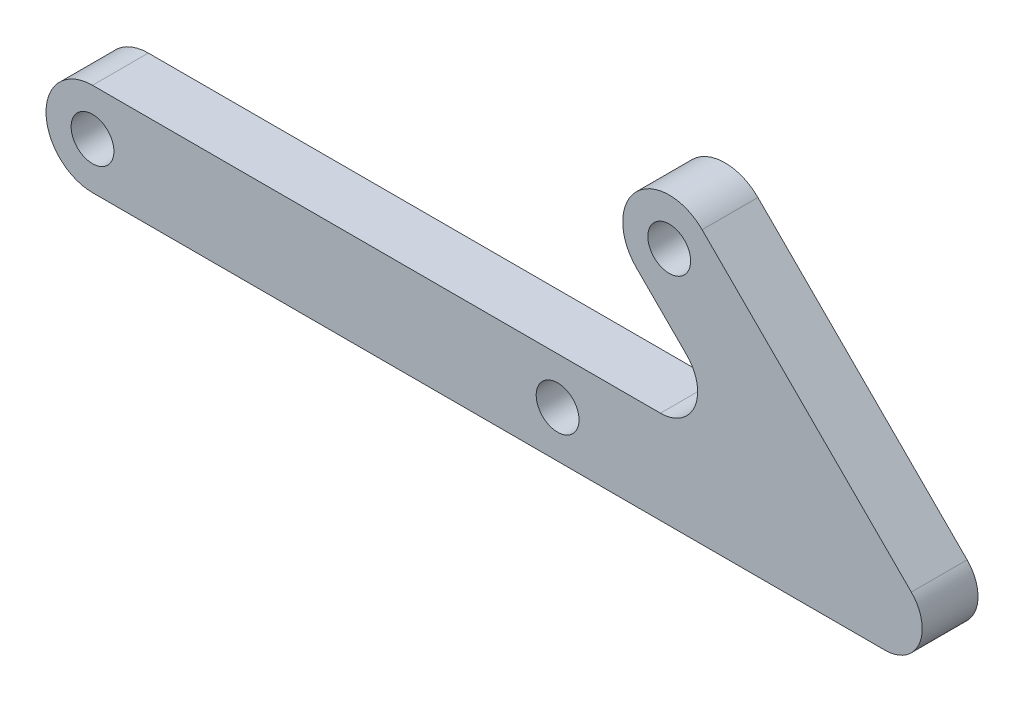
ISO-10303-21;
HEADER;
FILE_DESCRIPTION(('STEP AP214'),'2;1');
FILE_NAME('part.step','',(''),(''),'','','');
FILE_SCHEMA(('AUTOMOTIVE_DESIGN { 1 0 10303 214 1 1 1 1 }'));
ENDSEC;
DATA;
#1=APPLICATION_CONTEXT('core data for automotive mechanical design processes');
#2=APPLICATION_PROTOCOL_DEFINITION('international standard','automotive_design',2000,#1);
#3=PRODUCT_CONTEXT('',#1,'mechanical');
#4=PRODUCT('Part','Part','',(#3));
#5=PRODUCT_RELATED_PRODUCT_CATEGORY('part','',(#4));
#6=PRODUCT_DEFINITION_FORMATION('','',#4);
#7=PRODUCT_DEFINITION_CONTEXT('part definition',#1,'design');
#8=PRODUCT_DEFINITION('design','',#6,#7);
#9=PRODUCT_DEFINITION_SHAPE('','',#8);
#10=(LENGTH_UNIT() NAMED_UNIT(*) SI_UNIT(.MILLI.,.METRE.));
#11=(NAMED_UNIT(*) PLANE_ANGLE_UNIT() SI_UNIT($,.RADIAN.));
#12=(NAMED_UNIT(*) SI_UNIT($,.STERADIAN.) SOLID_ANGLE_UNIT());
#13=UNCERTAINTY_MEASURE_WITH_UNIT(LENGTH_MEASURE(1.E-05),#10,'distance_accuracy_value','');
#14=(GEOMETRIC_REPRESENTATION_CONTEXT(3) GLOBAL_UNCERTAINTY_ASSIGNED_CONTEXT((#13)) GLOBAL_UNIT_ASSIGNED_CONTEXT((#10,
#11,#12)) REPRESENTATION_CONTEXT('',''));
#15=CARTESIAN_POINT('',(0.,0.,0.));
#16=DIRECTION('',(0.,0.,1.));
#17=DIRECTION('',(1.,0.,0.));
#18=AXIS2_PLACEMENT_3D('',#15,#16,#17);
#19=CARTESIAN_POINT('',(42.5994116266,-0.5,3.));
#20=DIRECTION('',(0.,0.,-1.));
#21=DIRECTION('',(-1.,0.,0.));
#22=AXIS2_PLACEMENT_3D('',#19,#20,#21);
#23=CYLINDRICAL_SURFACE('',#22,2.);
#24=CARTESIAN_POINT('',(42.5994116266,-0.5,3.));
#25=DIRECTION('',(0.,0.,1.));
#26=DIRECTION('',(1.,0.,0.));
#27=AXIS2_PLACEMENT_3D('',#24,#25,#26);
#28=CIRCLE('',#27,2.);
#29=CARTESIAN_POINT('',(42.5994116266,-2.5,3.));
#30=VERTEX_POINT('',#29);
#31=CARTESIAN_POINT('',(44.0136251889731,0.914213562373096,3.));
#32=VERTEX_POINT('',#31);
#33=EDGE_CURVE('E183',#30,#32,#28,.T.);
#34=ORIENTED_EDGE('',*,*,#33,.F.);
#35=DIRECTION('',(0.,0.,1.));
#36=VECTOR('',#35,1.);
#37=CARTESIAN_POINT('',(42.5994116266,-2.5,3.));
#38=LINE('',#37,#36);
#39=CARTESIAN_POINT('',(42.5994116266,-2.5,0.));
#40=VERTEX_POINT('',#39);
#41=EDGE_CURVE('E162',#40,#30,#38,.T.);
#42=ORIENTED_EDGE('',*,*,#41,.F.);
#43=CARTESIAN_POINT('',(42.5994116266,-0.5,0.));
#44=DIRECTION('',(0.,0.,-1.));
#45=DIRECTION('',(1.,0.,0.));
#46=AXIS2_PLACEMENT_3D('',#43,#44,#45);
#47=CIRCLE('',#46,2.);
#48=CARTESIAN_POINT('',(44.0136251889731,0.914213562373096,0.));
#49=VERTEX_POINT('',#48);
#50=EDGE_CURVE('E25',#49,#40,#47,.T.);
#51=ORIENTED_EDGE('',*,*,#50,.F.);
#52=DIRECTION('',(0.,0.,-1.));
#53=VECTOR('',#52,1.);
#54=CARTESIAN_POINT('',(44.0136251889731,0.914213562373103,3.));
#55=LINE('',#54,#53);
#56=EDGE_CURVE('E191',#32,#49,#55,.T.);
#57=ORIENTED_EDGE('',*,*,#56,.F.);
#58=EDGE_LOOP('',(#34,#42,#51,#57));
#59=FACE_BOUND('',#58,.T.);
#60=ADVANCED_FACE('F17',(#59),#23,.T.);
#61=CARTESIAN_POINT('',(30.5283438147343,4.5,3.));
#62=DIRECTION('',(0.,0.,-1.));
#63=DIRECTION('',(-1.,0.,0.));
#64=AXIS2_PLACEMENT_3D('',#61,#62,#63);
#65=CYLINDRICAL_SURFACE('',#64,2.);
#66=CARTESIAN_POINT('',(30.5283438147343,4.5,3.));
#67=DIRECTION('',(0.,0.,-1.));
#68=DIRECTION('',(1.,0.,0.));
#69=AXIS2_PLACEMENT_3D('',#66,#67,#68);
#70=CIRCLE('',#69,2.);
#71=CARTESIAN_POINT('',(31.9425573771075,5.9142135623731,3.));
#72=VERTEX_POINT('',#71);
#73=CARTESIAN_POINT('',(30.5283438147343,2.5,3.));
#74=VERTEX_POINT('',#73);
#75=EDGE_CURVE('E186',#72,#74,#70,.T.);
#76=ORIENTED_EDGE('',*,*,#75,.F.);
#77=DIRECTION('',(0.,0.,1.));
#78=VECTOR('',#77,1.);
#79=CARTESIAN_POINT('',(31.9425573771075,5.91421356237311,3.));
#80=LINE('',#79,#78);
#81=CARTESIAN_POINT('',(31.9425573771075,5.9142135623731,0.));
#82=VERTEX_POINT('',#81);
#83=EDGE_CURVE('E115',#82,#72,#80,.T.);
#84=ORIENTED_EDGE('',*,*,#83,.F.);
#85=CARTESIAN_POINT('',(30.5283438147343,4.5,0.));
#86=DIRECTION('',(0.,0.,1.));
#87=DIRECTION('',(1.,0.,0.));
#88=AXIS2_PLACEMENT_3D('',#85,#86,#87);
#89=CIRCLE('',#88,2.);
#90=CARTESIAN_POINT('',(30.5283438147343,2.5,0.));
#91=VERTEX_POINT('',#90);
#92=EDGE_CURVE('E11',#91,#82,#89,.T.);
#93=ORIENTED_EDGE('',*,*,#92,.F.);
#94=DIRECTION('',(0.,0.,-1.));
#95=VECTOR('',#94,1.);
#96=CARTESIAN_POINT('',(30.5283438147343,2.5,3.));
#97=LINE('',#96,#95);
#98=EDGE_CURVE('E175',#74,#91,#97,.T.);
#99=ORIENTED_EDGE('',*,*,#98,.F.);
#100=EDGE_LOOP('',(#76,#84,#93,#99));
#101=FACE_BOUND('',#100,.T.);
#102=ADVANCED_FACE('F249',(#101),#65,.F.);
#103=CARTESIAN_POINT('',(0.,0.,0.));
#104=DIRECTION('',(0.,0.,1.));
#105=DIRECTION('',(1.,0.,0.));
#106=AXIS2_PLACEMENT_3D('',#103,#104,#105);
#107=PLANE('',#106);
#108=CARTESIAN_POINT('',(31.,10.3923048454133,0.));
#109=DIRECTION('',(0.,0.,1.));
#110=DIRECTION('',(1.,0.,0.));
#111=AXIS2_PLACEMENT_3D('',#108,#109,#110);
#112=CIRCLE('',#111,1.15);
#113=CARTESIAN_POINT('',(32.15,10.3923048454133,0.));
#114=VERTEX_POINT('',#113);
#115=EDGE_CURVE('E137',#114,#114,#112,.T.);
#116=ORIENTED_EDGE('',*,*,#115,.T.);
#117=EDGE_LOOP('',(#116));
#118=FACE_BOUND('',#117,.T.);
#119=CARTESIAN_POINT('',(25.,0.,0.));
#120=DIRECTION('',(0.,0.,1.));
#121=DIRECTION('',(1.,0.,0.));
#122=AXIS2_PLACEMENT_3D('',#119,#120,#121);
#123=CIRCLE('',#122,1.15);
#124=CARTESIAN_POINT('',(26.15,0.,0.));
#125=VERTEX_POINT('',#124);
#126=EDGE_CURVE('E152',#125,#125,#123,.T.);
#127=ORIENTED_EDGE('',*,*,#126,.T.);
#128=EDGE_LOOP('',(#127));
#129=FACE_BOUND('',#128,.T.);
#130=CARTESIAN_POINT('',(0.,0.,0.));
#131=DIRECTION('',(0.,0.,1.));
#132=DIRECTION('',(1.,0.,0.));
#133=AXIS2_PLACEMENT_3D('',#130,#131,#132);
#134=CIRCLE('',#133,1.15);
#135=CARTESIAN_POINT('',(1.15,0.,0.));
#136=VERTEX_POINT('',#135);
#137=EDGE_CURVE('E143',#136,#136,#134,.T.);
#138=ORIENTED_EDGE('',*,*,#137,.T.);
#139=EDGE_LOOP('',(#138));
#140=FACE_BOUND('',#139,.T.);
#141=DIRECTION('',(-0.707106781186552,0.707106781186544,0.));
#142=VECTOR('',#141,1.);
#143=CARTESIAN_POINT('',(22.4639193756728,22.4639193756731,0.));
#144=LINE('',#143,#142);
#145=CARTESIAN_POINT('',(32.7677669529663,12.1600717983797,0.));
#146=VERTEX_POINT('',#145);
#147=EDGE_CURVE('E196',#49,#146,#144,.T.);
#148=ORIENTED_EDGE('',*,*,#147,.F.);
#149=ORIENTED_EDGE('',*,*,#50,.T.);
#150=DIRECTION('',(1.,0.,0.));
#151=VECTOR('',#150,1.);
#152=CARTESIAN_POINT('',(0.,-2.5,0.));
#153=LINE('',#152,#151);
#154=CARTESIAN_POINT('',(0.,-2.5,0.));
#155=VERTEX_POINT('',#154);
#156=EDGE_CURVE('E189',#155,#40,#153,.T.);
#157=ORIENTED_EDGE('',*,*,#156,.F.);
#158=CARTESIAN_POINT('',(0.,0.,0.));
#159=DIRECTION('',(0.,0.,1.));
#160=DIRECTION('',(1.,0.,0.));
#161=AXIS2_PLACEMENT_3D('',#158,#159,#160);
#162=CIRCLE('',#161,2.5);
#163=CARTESIAN_POINT('',(0.,2.5,0.));
#164=VERTEX_POINT('',#163);
#165=EDGE_CURVE('E148',#164,#155,#162,.T.);
#166=ORIENTED_EDGE('',*,*,#165,.F.);
#167=DIRECTION('',(1.,0.,0.));
#168=VECTOR('',#167,1.);
#169=CARTESIAN_POINT('',(0.,2.5,0.));
#170=LINE('',#169,#168);
#171=EDGE_CURVE('E176',#164,#91,#170,.T.);
#172=ORIENTED_EDGE('',*,*,#171,.T.);
#173=ORIENTED_EDGE('',*,*,#92,.T.);
#174=DIRECTION('',(0.707106781186552,-0.707106781186544,0.));
#175=VECTOR('',#174,1.);
#176=CARTESIAN_POINT('',(18.9283854697401,18.9283854697403,0.));
#177=LINE('',#176,#175);
#178=CARTESIAN_POINT('',(29.2322330470337,8.6245378924469,0.));
#179=VERTEX_POINT('',#178);
#180=EDGE_CURVE('E102',#179,#82,#177,.T.);
#181=ORIENTED_EDGE('',*,*,#180,.F.);
#182=CARTESIAN_POINT('',(31.,10.3923048454133,0.));
#183=DIRECTION('',(0.,0.,1.));
#184=DIRECTION('',(1.,0.,0.));
#185=AXIS2_PLACEMENT_3D('',#182,#183,#184);
#186=CIRCLE('',#185,2.5);
#187=EDGE_CURVE('E36',#146,#179,#186,.T.);
#188=ORIENTED_EDGE('',*,*,#187,.F.);
#189=EDGE_LOOP('',(#148,#149,#157,#166,#172,#173,#181,#188));
#190=FACE_BOUND('',#189,.T.);
#191=ADVANCED_FACE('F106',(#118,#129,#140,#190),#107,.F.);
#192=CARTESIAN_POINT('',(0.,0.,3.));
#193=DIRECTION('',(0.,0.,1.));
#194=DIRECTION('',(1.,0.,0.));
#195=AXIS2_PLACEMENT_3D('',#192,#193,#194);
#196=PLANE('',#195);
#197=CARTESIAN_POINT('',(31.,10.3923048454133,3.));
#198=DIRECTION('',(0.,0.,1.));
#199=DIRECTION('',(1.,0.,0.));
#200=AXIS2_PLACEMENT_3D('',#197,#198,#199);
#201=CIRCLE('',#200,1.15);
#202=CARTESIAN_POINT('',(32.15,10.3923048454133,3.));
#203=VERTEX_POINT('',#202);
#204=EDGE_CURVE('E225',#203,#203,#201,.T.);
#205=ORIENTED_EDGE('',*,*,#204,.F.);
#206=EDGE_LOOP('',(#205));
#207=FACE_BOUND('',#206,.T.);
#208=CARTESIAN_POINT('',(25.,0.,3.));
#209=DIRECTION('',(0.,0.,1.));
#210=DIRECTION('',(1.,0.,0.));
#211=AXIS2_PLACEMENT_3D('',#208,#209,#210);
#212=CIRCLE('',#211,1.15);
#213=CARTESIAN_POINT('',(26.15,0.,3.));
#214=VERTEX_POINT('',#213);
#215=EDGE_CURVE('E144',#214,#214,#212,.T.);
#216=ORIENTED_EDGE('',*,*,#215,.F.);
#217=EDGE_LOOP('',(#216));
#218=FACE_BOUND('',#217,.T.);
#219=CARTESIAN_POINT('',(0.,0.,3.));
#220=DIRECTION('',(0.,0.,1.));
#221=DIRECTION('',(1.,0.,0.));
#222=AXIS2_PLACEMENT_3D('',#219,#220,#221);
#223=CIRCLE('',#222,1.15);
#224=CARTESIAN_POINT('',(1.15,0.,3.));
#225=VERTEX_POINT('',#224);
#226=EDGE_CURVE('E124',#225,#225,#223,.T.);
#227=ORIENTED_EDGE('',*,*,#226,.F.);
#228=EDGE_LOOP('',(#227));
#229=FACE_BOUND('',#228,.T.);
#230=DIRECTION('',(1.,0.,0.));
#231=VECTOR('',#230,1.);
#232=CARTESIAN_POINT('',(0.,-2.5,3.));
#233=LINE('',#232,#231);
#234=CARTESIAN_POINT('',(0.,-2.5,3.));
#235=VERTEX_POINT('',#234);
#236=EDGE_CURVE('E158',#235,#30,#233,.T.);
#237=ORIENTED_EDGE('',*,*,#236,.T.);
#238=ORIENTED_EDGE('',*,*,#33,.T.);
#239=DIRECTION('',(-0.707106781186552,0.707106781186544,0.));
#240=VECTOR('',#239,1.);
#241=CARTESIAN_POINT('',(22.4639193756728,22.4639193756731,3.));
#242=LINE('',#241,#240);
#243=CARTESIAN_POINT('',(32.7677669529663,12.1600717983797,3.));
#244=VERTEX_POINT('',#243);
#245=EDGE_CURVE('E165',#32,#244,#242,.T.);
#246=ORIENTED_EDGE('',*,*,#245,.T.);
#247=CARTESIAN_POINT('',(31.,10.3923048454133,3.));
#248=DIRECTION('',(0.,0.,1.));
#249=DIRECTION('',(1.,0.,0.));
#250=AXIS2_PLACEMENT_3D('',#247,#248,#249);
#251=CIRCLE('',#250,2.5);
#252=CARTESIAN_POINT('',(29.2322330470337,8.6245378924469,3.));
#253=VERTEX_POINT('',#252);
#254=EDGE_CURVE('E129',#244,#253,#251,.T.);
#255=ORIENTED_EDGE('',*,*,#254,.T.);
#256=DIRECTION('',(0.707106781186552,-0.707106781186544,0.));
#257=VECTOR('',#256,1.);
#258=CARTESIAN_POINT('',(18.9283854697401,18.9283854697403,3.));
#259=LINE('',#258,#257);
#260=EDGE_CURVE('E118',#253,#72,#259,.T.);
#261=ORIENTED_EDGE('',*,*,#260,.T.);
#262=ORIENTED_EDGE('',*,*,#75,.T.);
#263=DIRECTION('',(1.,0.,0.));
#264=VECTOR('',#263,1.);
#265=CARTESIAN_POINT('',(0.,2.5,3.));
#266=LINE('',#265,#264);
#267=CARTESIAN_POINT('',(0.,2.5,3.));
#268=VERTEX_POINT('',#267);
#269=EDGE_CURVE('E171',#268,#74,#266,.T.);
#270=ORIENTED_EDGE('',*,*,#269,.F.);
#271=CARTESIAN_POINT('',(0.,0.,3.));
#272=DIRECTION('',(0.,0.,1.));
#273=DIRECTION('',(1.,0.,0.));
#274=AXIS2_PLACEMENT_3D('',#271,#272,#273);
#275=CIRCLE('',#274,2.5);
#276=EDGE_CURVE('E147',#268,#235,#275,.T.);
#277=ORIENTED_EDGE('',*,*,#276,.T.);
#278=EDGE_LOOP('',(#237,#238,#246,#255,#261,#262,#270,#277));
#279=FACE_BOUND('',#278,.T.);
#280=ADVANCED_FACE('F234',(#207,#218,#229,#279),#196,.T.);
#281=CARTESIAN_POINT('',(22.4639193756728,22.4639193756731,3.));
#282=DIRECTION('',(-0.707106781186544,-0.707106781186552,0.));
#283=DIRECTION('',(-0.707106781186552,0.707106781186544,0.));
#284=AXIS2_PLACEMENT_3D('',#281,#282,#283);
#285=PLANE('',#284);
#286=ORIENTED_EDGE('',*,*,#245,.F.);
#287=ORIENTED_EDGE('',*,*,#56,.T.);
#288=ORIENTED_EDGE('',*,*,#147,.T.);
#289=DIRECTION('',(0.,0.,-1.));
#290=VECTOR('',#289,1.);
#291=CARTESIAN_POINT('',(32.7677669529663,12.1600717983797,3.));
#292=LINE('',#291,#290);
#293=EDGE_CURVE('E126',#244,#146,#292,.T.);
#294=ORIENTED_EDGE('',*,*,#293,.F.);
#295=EDGE_LOOP('',(#286,#287,#288,#294));
#296=FACE_BOUND('',#295,.T.);
#297=ADVANCED_FACE('F240',(#296),#285,.F.);
#298=CARTESIAN_POINT('',(0.,-2.5,3.));
#299=DIRECTION('',(0.,1.,0.));
#300=DIRECTION('',(1.,0.,0.));
#301=AXIS2_PLACEMENT_3D('',#298,#299,#300);
#302=PLANE('',#301);
#303=ORIENTED_EDGE('',*,*,#156,.T.);
#304=ORIENTED_EDGE('',*,*,#41,.T.);
#305=ORIENTED_EDGE('',*,*,#236,.F.);
#306=DIRECTION('',(0.,0.,-1.));
#307=VECTOR('',#306,1.);
#308=CARTESIAN_POINT('',(0.,-2.5,3.));
#309=LINE('',#308,#307);
#310=EDGE_CURVE('E114',#235,#155,#309,.T.);
#311=ORIENTED_EDGE('',*,*,#310,.T.);
#312=EDGE_LOOP('',(#303,#304,#305,#311));
#313=FACE_BOUND('',#312,.T.);
#314=ADVANCED_FACE('F209',(#313),#302,.F.);
#315=CARTESIAN_POINT('',(0.,2.5,3.));
#316=DIRECTION('',(0.,1.,0.));
#317=DIRECTION('',(1.,0.,0.));
#318=AXIS2_PLACEMENT_3D('',#315,#316,#317);
#319=PLANE('',#318);
#320=ORIENTED_EDGE('',*,*,#269,.T.);
#321=ORIENTED_EDGE('',*,*,#98,.T.);
#322=ORIENTED_EDGE('',*,*,#171,.F.);
#323=DIRECTION('',(0.,0.,-1.));
#324=VECTOR('',#323,1.);
#325=CARTESIAN_POINT('',(0.,2.5,3.));
#326=LINE('',#325,#324);
#327=EDGE_CURVE('E181',#268,#164,#326,.T.);
#328=ORIENTED_EDGE('',*,*,#327,.F.);
#329=EDGE_LOOP('',(#320,#321,#322,#328));
#330=FACE_BOUND('',#329,.T.);
#331=ADVANCED_FACE('F247',(#330),#319,.T.);
#332=CARTESIAN_POINT('',(18.9283854697401,18.9283854697403,3.));
#333=DIRECTION('',(0.707106781186544,0.707106781186552,0.));
#334=DIRECTION('',(0.,0.,-1.));
#335=AXIS2_PLACEMENT_3D('',#332,#333,#334);
#336=PLANE('',#335);
#337=ORIENTED_EDGE('',*,*,#180,.T.);
#338=ORIENTED_EDGE('',*,*,#83,.T.);
#339=ORIENTED_EDGE('',*,*,#260,.F.);
#340=DIRECTION('',(0.,0.,-1.));
#341=VECTOR('',#340,1.);
#342=CARTESIAN_POINT('',(29.2322330470337,8.6245378924469,3.));
#343=LINE('',#342,#341);
#344=EDGE_CURVE('E116',#253,#179,#343,.T.);
#345=ORIENTED_EDGE('',*,*,#344,.T.);
#346=EDGE_LOOP('',(#337,#338,#339,#345));
#347=FACE_BOUND('',#346,.T.);
#348=ADVANCED_FACE('F117',(#347),#336,.F.);
#349=CARTESIAN_POINT('',(0.,0.,3.));
#350=DIRECTION('',(0.,0.,-1.));
#351=DIRECTION('',(-1.,0.,0.));
#352=AXIS2_PLACEMENT_3D('',#349,#350,#351);
#353=CYLINDRICAL_SURFACE('',#352,2.5);
#354=ORIENTED_EDGE('',*,*,#276,.F.);
#355=ORIENTED_EDGE('',*,*,#327,.T.);
#356=ORIENTED_EDGE('',*,*,#165,.T.);
#357=ORIENTED_EDGE('',*,*,#310,.F.);
#358=EDGE_LOOP('',(#354,#355,#356,#357));
#359=FACE_BOUND('',#358,.T.);
#360=ADVANCED_FACE('F241',(#359),#353,.T.);
#361=CARTESIAN_POINT('',(25.,0.,3.));
#362=DIRECTION('',(0.,0.,-1.));
#363=DIRECTION('',(-1.,0.,0.));
#364=AXIS2_PLACEMENT_3D('',#361,#362,#363);
#365=CYLINDRICAL_SURFACE('',#364,1.15);
#366=ORIENTED_EDGE('',*,*,#126,.F.);
#367=EDGE_LOOP('',(#366));
#368=FACE_BOUND('',#367,.T.);
#369=ORIENTED_EDGE('',*,*,#215,.T.);
#370=EDGE_LOOP('',(#369));
#371=FACE_BOUND('',#370,.T.);
#372=ADVANCED_FACE('F276',(#368,#371),#365,.F.);
#373=CARTESIAN_POINT('',(0.,0.,3.));
#374=DIRECTION('',(0.,0.,-1.));
#375=DIRECTION('',(-1.,0.,0.));
#376=AXIS2_PLACEMENT_3D('',#373,#374,#375);
#377=CYLINDRICAL_SURFACE('',#376,1.15);
#378=ORIENTED_EDGE('',*,*,#137,.F.);
#379=EDGE_LOOP('',(#378));
#380=FACE_BOUND('',#379,.T.);
#381=ORIENTED_EDGE('',*,*,#226,.T.);
#382=EDGE_LOOP('',(#381));
#383=FACE_BOUND('',#382,.T.);
#384=ADVANCED_FACE('F232',(#380,#383),#377,.F.);
#385=CARTESIAN_POINT('',(31.,10.3923048454133,3.));
#386=DIRECTION('',(0.,0.,-1.));
#387=DIRECTION('',(-1.,0.,0.));
#388=AXIS2_PLACEMENT_3D('',#385,#386,#387);
#389=CYLINDRICAL_SURFACE('',#388,2.5);
#390=ORIENTED_EDGE('',*,*,#254,.F.);
#391=ORIENTED_EDGE('',*,*,#293,.T.);
#392=ORIENTED_EDGE('',*,*,#187,.T.);
#393=ORIENTED_EDGE('',*,*,#344,.F.);
#394=EDGE_LOOP('',(#390,#391,#392,#393));
#395=FACE_BOUND('',#394,.T.);
#396=ADVANCED_FACE('F123',(#395),#389,.T.);
#397=CARTESIAN_POINT('',(31.,10.3923048454133,3.));
#398=DIRECTION('',(0.,0.,-1.));
#399=DIRECTION('',(-1.,0.,0.));
#400=AXIS2_PLACEMENT_3D('',#397,#398,#399);
#401=CYLINDRICAL_SURFACE('',#400,1.15);
#402=ORIENTED_EDGE('',*,*,#115,.F.);
#403=EDGE_LOOP('',(#402));
#404=FACE_BOUND('',#403,.T.);
#405=ORIENTED_EDGE('',*,*,#204,.T.);
#406=EDGE_LOOP('',(#405));
#407=FACE_BOUND('',#406,.T.);
#408=ADVANCED_FACE('F273',(#404,#407),#401,.F.);
#409=CLOSED_SHELL('',(#60,#102,#191,#280,#297,#314,#331,#348,#360,#372,#384,#396,#408));
#410=MANIFOLD_SOLID_BREP('B1',#409);
#411=ADVANCED_BREP_SHAPE_REPRESENTATION('',(#18,#410),#14);
#412=SHAPE_DEFINITION_REPRESENTATION(#9,#411);
ENDSEC;
END-ISO-10303-21;
